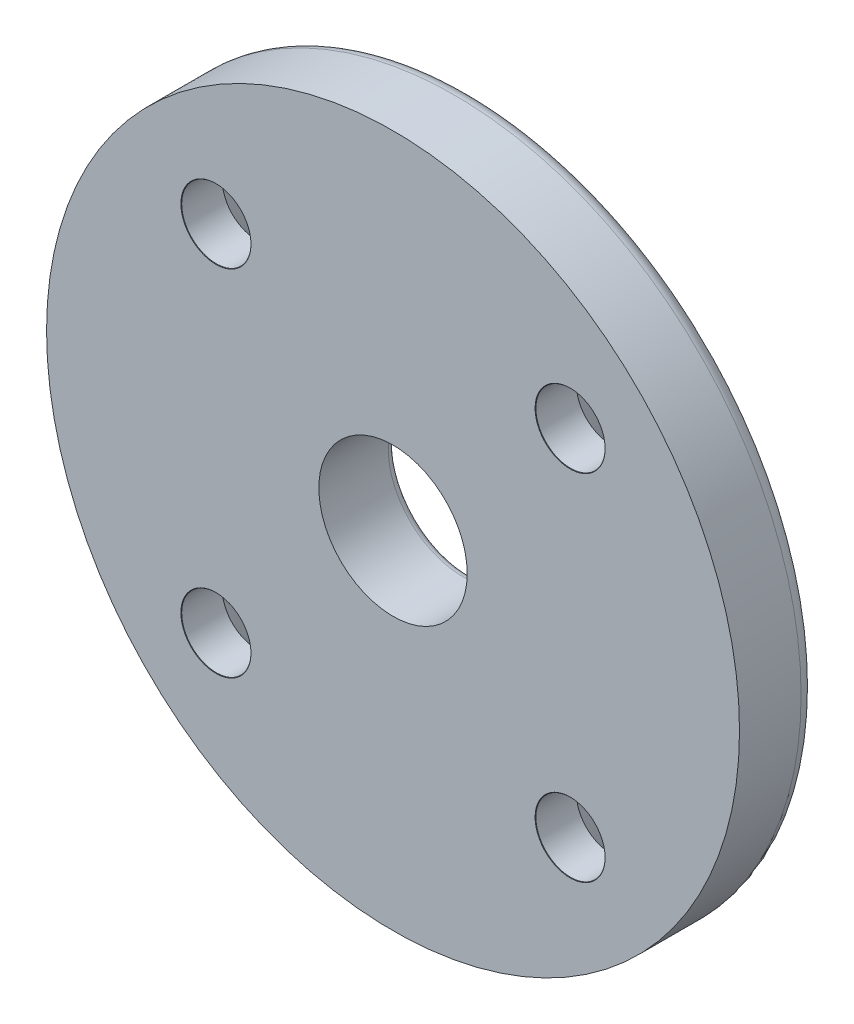
ISO-10303-21;
HEADER;
FILE_DESCRIPTION(('STEP AP214'),'2;1');
FILE_NAME('part.step','',(''),(''),'','','');
FILE_SCHEMA(('AUTOMOTIVE_DESIGN { 1 0 10303 214 1 1 1 1 }'));
ENDSEC;
DATA;
#1=APPLICATION_CONTEXT('core data for automotive mechanical design processes');
#2=APPLICATION_PROTOCOL_DEFINITION('international standard','automotive_design',2000,#1);
#3=PRODUCT_CONTEXT('',#1,'mechanical');
#4=PRODUCT('Part','Part','',(#3));
#5=PRODUCT_RELATED_PRODUCT_CATEGORY('part','',(#4));
#6=PRODUCT_DEFINITION_FORMATION('','',#4);
#7=PRODUCT_DEFINITION_CONTEXT('part definition',#1,'design');
#8=PRODUCT_DEFINITION('design','',#6,#7);
#9=PRODUCT_DEFINITION_SHAPE('','',#8);
#10=(LENGTH_UNIT() NAMED_UNIT(*) SI_UNIT(.MILLI.,.METRE.));
#11=(NAMED_UNIT(*) PLANE_ANGLE_UNIT() SI_UNIT($,.RADIAN.));
#12=(NAMED_UNIT(*) SI_UNIT($,.STERADIAN.) SOLID_ANGLE_UNIT());
#13=UNCERTAINTY_MEASURE_WITH_UNIT(LENGTH_MEASURE(1.E-05),#10,'distance_accuracy_value','');
#14=(GEOMETRIC_REPRESENTATION_CONTEXT(3) GLOBAL_UNCERTAINTY_ASSIGNED_CONTEXT((#13)) GLOBAL_UNIT_ASSIGNED_CONTEXT((#10,
#11,#12)) REPRESENTATION_CONTEXT('',''));
#15=CARTESIAN_POINT('',(0.,0.,0.));
#16=DIRECTION('',(0.,0.,1.));
#17=DIRECTION('',(1.,0.,0.));
#18=AXIS2_PLACEMENT_3D('',#15,#16,#17);
#19=CARTESIAN_POINT('',(0.,0.,0.));
#20=DIRECTION('',(0.,0.,1.));
#21=DIRECTION('',(1.,0.,0.));
#22=AXIS2_PLACEMENT_3D('',#19,#20,#21);
#23=PLANE('',#22);
#24=CARTESIAN_POINT('',(11.5,11.5,0.));
#25=DIRECTION('',(0.,0.,-1.));
#26=DIRECTION('',(-1.,0.,0.));
#27=AXIS2_PLACEMENT_3D('',#24,#25,#26);
#28=CIRCLE('',#27,4.59);
#29=CARTESIAN_POINT('',(6.91,11.5,0.));
#30=VERTEX_POINT('',#29);
#31=EDGE_CURVE('E102',#30,#30,#28,.T.);
#32=ORIENTED_EDGE('',*,*,#31,.F.);
#33=EDGE_LOOP('',(#32));
#34=FACE_BOUND('',#33,.T.);
#35=CARTESIAN_POINT('',(-11.5,11.5,0.));
#36=DIRECTION('',(0.,0.,-1.));
#37=DIRECTION('',(-1.,0.,0.));
#38=AXIS2_PLACEMENT_3D('',#35,#36,#37);
#39=CIRCLE('',#38,4.59);
#40=CARTESIAN_POINT('',(-16.09,11.5,0.));
#41=VERTEX_POINT('',#40);
#42=EDGE_CURVE('E90',#41,#41,#39,.T.);
#43=ORIENTED_EDGE('',*,*,#42,.F.);
#44=EDGE_LOOP('',(#43));
#45=FACE_BOUND('',#44,.T.);
#46=CARTESIAN_POINT('',(0.,0.,0.));
#47=DIRECTION('',(0.,0.,1.));
#48=DIRECTION('',(1.,0.,0.));
#49=AXIS2_PLACEMENT_3D('',#46,#47,#48);
#50=CIRCLE('',#49,21.5);
#51=CARTESIAN_POINT('',(21.5,0.,0.));
#52=VERTEX_POINT('',#51);
#53=EDGE_CURVE('E45',#52,#52,#50,.F.);
#54=ORIENTED_EDGE('',*,*,#53,.T.);
#55=EDGE_LOOP('',(#54));
#56=FACE_BOUND('',#55,.T.);
#57=CARTESIAN_POINT('',(0.,0.,0.));
#58=DIRECTION('',(0.,0.,1.));
#59=DIRECTION('',(1.,0.,0.));
#60=AXIS2_PLACEMENT_3D('',#57,#58,#59);
#61=CIRCLE('',#60,5.31847519493753);
#62=CARTESIAN_POINT('',(5.31847519493753,0.,0.));
#63=VERTEX_POINT('',#62);
#64=EDGE_CURVE('E41',#63,#63,#61,.T.);
#65=ORIENTED_EDGE('',*,*,#64,.T.);
#66=EDGE_LOOP('',(#65));
#67=FACE_BOUND('',#66,.T.);
#68=CARTESIAN_POINT('',(-11.5,-11.5,0.));
#69=DIRECTION('',(0.,0.,-1.));
#70=DIRECTION('',(-1.,0.,0.));
#71=AXIS2_PLACEMENT_3D('',#68,#69,#70);
#72=CIRCLE('',#71,4.59);
#73=CARTESIAN_POINT('',(-16.09,-11.5,0.));
#74=VERTEX_POINT('',#73);
#75=EDGE_CURVE('E66',#74,#74,#72,.T.);
#76=ORIENTED_EDGE('',*,*,#75,.F.);
#77=EDGE_LOOP('',(#76));
#78=FACE_BOUND('',#77,.T.);
#79=CARTESIAN_POINT('',(11.5,-11.5,0.));
#80=DIRECTION('',(0.,0.,-1.));
#81=DIRECTION('',(-1.,0.,0.));
#82=AXIS2_PLACEMENT_3D('',#79,#80,#81);
#83=CIRCLE('',#82,4.59);
#84=CARTESIAN_POINT('',(6.91,-11.5,0.));
#85=VERTEX_POINT('',#84);
#86=EDGE_CURVE('E78',#85,#85,#83,.T.);
#87=ORIENTED_EDGE('',*,*,#86,.F.);
#88=EDGE_LOOP('',(#87));
#89=FACE_BOUND('',#88,.T.);
#90=ADVANCED_FACE('F34',(#34,#45,#56,#67,#78,#89),#23,.F.);
#91=CARTESIAN_POINT('',(0.,0.,5.));
#92=DIRECTION('',(0.,0.,1.));
#93=DIRECTION('',(1.,0.,0.));
#94=AXIS2_PLACEMENT_3D('',#91,#92,#93);
#95=PLANE('',#94);
#96=CARTESIAN_POINT('',(11.5,11.5,5.));
#97=DIRECTION('',(0.,0.,-1.));
#98=DIRECTION('',(-1.,0.,0.));
#99=AXIS2_PLACEMENT_3D('',#96,#97,#98);
#100=CIRCLE('',#99,2.275);
#101=CARTESIAN_POINT('',(9.225,11.5,5.));
#102=VERTEX_POINT('',#101);
#103=EDGE_CURVE('E105',#102,#102,#100,.T.);
#104=ORIENTED_EDGE('',*,*,#103,.T.);
#105=EDGE_LOOP('',(#104));
#106=FACE_BOUND('',#105,.T.);
#107=CARTESIAN_POINT('',(-11.5,11.5,5.));
#108=DIRECTION('',(0.,0.,-1.));
#109=DIRECTION('',(-1.,0.,0.));
#110=AXIS2_PLACEMENT_3D('',#107,#108,#109);
#111=CIRCLE('',#110,2.275);
#112=CARTESIAN_POINT('',(-13.775,11.5,5.));
#113=VERTEX_POINT('',#112);
#114=EDGE_CURVE('E93',#113,#113,#111,.T.);
#115=ORIENTED_EDGE('',*,*,#114,.T.);
#116=EDGE_LOOP('',(#115));
#117=FACE_BOUND('',#116,.T.);
#118=CARTESIAN_POINT('',(11.5,-11.5,5.));
#119=DIRECTION('',(0.,0.,-1.));
#120=DIRECTION('',(-1.,0.,0.));
#121=AXIS2_PLACEMENT_3D('',#118,#119,#120);
#122=CIRCLE('',#121,2.275);
#123=CARTESIAN_POINT('',(9.225,-11.5,5.));
#124=VERTEX_POINT('',#123);
#125=EDGE_CURVE('E81',#124,#124,#122,.T.);
#126=ORIENTED_EDGE('',*,*,#125,.T.);
#127=EDGE_LOOP('',(#126));
#128=FACE_BOUND('',#127,.T.);
#129=CARTESIAN_POINT('',(-11.5,-11.5,5.));
#130=DIRECTION('',(0.,0.,-1.));
#131=DIRECTION('',(-1.,0.,0.));
#132=AXIS2_PLACEMENT_3D('',#129,#130,#131);
#133=CIRCLE('',#132,2.275);
#134=CARTESIAN_POINT('',(-13.775,-11.5,5.));
#135=VERTEX_POINT('',#134);
#136=EDGE_CURVE('E69',#135,#135,#133,.T.);
#137=ORIENTED_EDGE('',*,*,#136,.T.);
#138=EDGE_LOOP('',(#137));
#139=FACE_BOUND('',#138,.T.);
#140=CARTESIAN_POINT('',(0.,0.,5.));
#141=DIRECTION('',(0.,0.,1.));
#142=DIRECTION('',(1.,0.,0.));
#143=AXIS2_PLACEMENT_3D('',#140,#141,#142);
#144=CIRCLE('',#143,22.5);
#145=CARTESIAN_POINT('',(22.5,0.,5.));
#146=VERTEX_POINT('',#145);
#147=EDGE_CURVE('E53',#146,#146,#144,.T.);
#148=ORIENTED_EDGE('',*,*,#147,.T.);
#149=EDGE_LOOP('',(#148));
#150=FACE_BOUND('',#149,.T.);
#151=CARTESIAN_POINT('',(0.,0.,5.));
#152=DIRECTION('',(0.,0.,1.));
#153=DIRECTION('',(1.,0.,0.));
#154=AXIS2_PLACEMENT_3D('',#151,#152,#153);
#155=CIRCLE('',#154,4.81847519493753);
#156=CARTESIAN_POINT('',(4.81847519493753,0.,5.));
#157=VERTEX_POINT('',#156);
#158=EDGE_CURVE('E57',#157,#157,#155,.T.);
#159=ORIENTED_EDGE('',*,*,#158,.F.);
#160=EDGE_LOOP('',(#159));
#161=FACE_BOUND('',#160,.T.);
#162=ADVANCED_FACE('F109',(#106,#117,#128,#139,#150,#161),#95,.T.);
#163=CARTESIAN_POINT('',(0.,0.,5.));
#164=DIRECTION('',(0.,0.,-1.));
#165=DIRECTION('',(-1.,0.,0.));
#166=AXIS2_PLACEMENT_3D('',#163,#164,#165);
#167=CYLINDRICAL_SURFACE('',#166,22.5);
#168=CARTESIAN_POINT('',(0.,0.,1.));
#169=DIRECTION('',(0.,0.,1.));
#170=DIRECTION('',(1.,0.,0.));
#171=AXIS2_PLACEMENT_3D('',#168,#169,#170);
#172=CIRCLE('',#171,22.5);
#173=CARTESIAN_POINT('',(22.5,0.,1.));
#174=VERTEX_POINT('',#173);
#175=EDGE_CURVE('E49',#174,#174,#172,.T.);
#176=ORIENTED_EDGE('',*,*,#175,.T.);
#177=EDGE_LOOP('',(#176));
#178=FACE_BOUND('',#177,.T.);
#179=ORIENTED_EDGE('',*,*,#147,.F.);
#180=EDGE_LOOP('',(#179));
#181=FACE_BOUND('',#180,.T.);
#182=ADVANCED_FACE('F180',(#178,#181),#167,.T.);
#183=CARTESIAN_POINT('',(0.,0.,5.));
#184=DIRECTION('',(0.,0.,-1.));
#185=DIRECTION('',(-1.,0.,0.));
#186=AXIS2_PLACEMENT_3D('',#183,#184,#185);
#187=CYLINDRICAL_SURFACE('',#186,4.81847519493753);
#188=CARTESIAN_POINT('',(0.,0.,0.5));
#189=DIRECTION('',(0.,0.,1.));
#190=DIRECTION('',(1.,0.,0.));
#191=AXIS2_PLACEMENT_3D('',#188,#189,#190);
#192=CIRCLE('',#191,4.81847519493753);
#193=CARTESIAN_POINT('',(4.81847519493753,0.,0.5));
#194=VERTEX_POINT('',#193);
#195=EDGE_CURVE('E11',#194,#194,#192,.F.);
#196=ORIENTED_EDGE('',*,*,#195,.T.);
#197=EDGE_LOOP('',(#196));
#198=FACE_BOUND('',#197,.T.);
#199=ORIENTED_EDGE('',*,*,#158,.T.);
#200=EDGE_LOOP('',(#199));
#201=FACE_BOUND('',#200,.T.);
#202=ADVANCED_FACE('F176',(#198,#201),#187,.F.);
#203=CARTESIAN_POINT('',(0.,0.,1.));
#204=DIRECTION('',(0.,0.,1.));
#205=DIRECTION('',(1.,0.,0.));
#206=AXIS2_PLACEMENT_3D('',#203,#204,#205);
#207=TOROIDAL_SURFACE('',#206,21.5,1.);
#208=ORIENTED_EDGE('',*,*,#53,.F.);
#209=EDGE_LOOP('',(#208));
#210=FACE_BOUND('',#209,.T.);
#211=ORIENTED_EDGE('',*,*,#175,.F.);
#212=EDGE_LOOP('',(#211));
#213=FACE_BOUND('',#212,.T.);
#214=ADVANCED_FACE('F179',(#210,#213),#207,.T.);
#215=CARTESIAN_POINT('',(0.,0.,0.5));
#216=DIRECTION('',(0.,0.,1.));
#217=DIRECTION('',(1.,0.,0.));
#218=AXIS2_PLACEMENT_3D('',#215,#216,#217);
#219=TOROIDAL_SURFACE('',#218,5.31847519493753,0.5);
#220=ORIENTED_EDGE('',*,*,#195,.F.);
#221=EDGE_LOOP('',(#220));
#222=FACE_BOUND('',#221,.T.);
#223=ORIENTED_EDGE('',*,*,#64,.F.);
#224=EDGE_LOOP('',(#223));
#225=FACE_BOUND('',#224,.T.);
#226=ADVANCED_FACE('F36',(#222,#225),#219,.T.);
#227=CARTESIAN_POINT('',(-11.5,-11.5,4.975));
#228=DIRECTION('',(0.,0.,1.));
#229=DIRECTION('',(1.,0.,0.));
#230=AXIS2_PLACEMENT_3D('',#227,#228,#229);
#231=CONICAL_SURFACE('',#230,2.25,0.785398163397466);
#232=ORIENTED_EDGE('',*,*,#136,.F.);
#233=EDGE_LOOP('',(#232));
#234=FACE_BOUND('',#233,.T.);
#235=CARTESIAN_POINT('',(-11.5,-11.5,4.975));
#236=DIRECTION('',(0.,0.,-1.));
#237=DIRECTION('',(-1.,0.,0.));
#238=AXIS2_PLACEMENT_3D('',#235,#236,#237);
#239=CIRCLE('',#238,2.25);
#240=CARTESIAN_POINT('',(-13.75,-11.5,4.975));
#241=VERTEX_POINT('',#240);
#242=EDGE_CURVE('E60',#241,#241,#239,.T.);
#243=ORIENTED_EDGE('',*,*,#242,.T.);
#244=EDGE_LOOP('',(#243));
#245=FACE_BOUND('',#244,.T.);
#246=ADVANCED_FACE('F171',(#234,#245),#231,.F.);
#247=CARTESIAN_POINT('',(-11.5,-11.5,0.));
#248=DIRECTION('',(0.,0.,-1.));
#249=DIRECTION('',(-1.,0.,0.));
#250=AXIS2_PLACEMENT_3D('',#247,#248,#249);
#251=CYLINDRICAL_SURFACE('',#250,2.25);
#252=ORIENTED_EDGE('',*,*,#242,.F.);
#253=EDGE_LOOP('',(#252));
#254=FACE_BOUND('',#253,.T.);
#255=CARTESIAN_POINT('',(-11.5,-11.5,2.34));
#256=DIRECTION('',(0.,0.,-1.));
#257=DIRECTION('',(-1.,0.,0.));
#258=AXIS2_PLACEMENT_3D('',#255,#256,#257);
#259=CIRCLE('',#258,2.25);
#260=CARTESIAN_POINT('',(-13.75,-11.5,2.34));
#261=VERTEX_POINT('',#260);
#262=EDGE_CURVE('E63',#261,#261,#259,.T.);
#263=ORIENTED_EDGE('',*,*,#262,.T.);
#264=EDGE_LOOP('',(#263));
#265=FACE_BOUND('',#264,.T.);
#266=ADVANCED_FACE('F167',(#254,#265),#251,.F.);
#267=CARTESIAN_POINT('',(-11.5,-11.5,0.));
#268=DIRECTION('',(0.,0.,-1.));
#269=DIRECTION('',(-1.,0.,0.));
#270=AXIS2_PLACEMENT_3D('',#267,#268,#269);
#271=CONICAL_SURFACE('',#270,4.59,0.785398163397448);
#272=ORIENTED_EDGE('',*,*,#262,.F.);
#273=EDGE_LOOP('',(#272));
#274=FACE_BOUND('',#273,.T.);
#275=ORIENTED_EDGE('',*,*,#75,.T.);
#276=EDGE_LOOP('',(#275));
#277=FACE_BOUND('',#276,.T.);
#278=ADVANCED_FACE('F163',(#274,#277),#271,.F.);
#279=CARTESIAN_POINT('',(11.5,-11.5,4.975));
#280=DIRECTION('',(0.,0.,1.));
#281=DIRECTION('',(1.,0.,0.));
#282=AXIS2_PLACEMENT_3D('',#279,#280,#281);
#283=CONICAL_SURFACE('',#282,2.25,0.785398163397466);
#284=ORIENTED_EDGE('',*,*,#125,.F.);
#285=EDGE_LOOP('',(#284));
#286=FACE_BOUND('',#285,.T.);
#287=CARTESIAN_POINT('',(11.5,-11.5,4.975));
#288=DIRECTION('',(0.,0.,-1.));
#289=DIRECTION('',(-1.,0.,0.));
#290=AXIS2_PLACEMENT_3D('',#287,#288,#289);
#291=CIRCLE('',#290,2.25);
#292=CARTESIAN_POINT('',(9.25,-11.5,4.975));
#293=VERTEX_POINT('',#292);
#294=EDGE_CURVE('E72',#293,#293,#291,.T.);
#295=ORIENTED_EDGE('',*,*,#294,.T.);
#296=EDGE_LOOP('',(#295));
#297=FACE_BOUND('',#296,.T.);
#298=ADVANCED_FACE('F155',(#286,#297),#283,.F.);
#299=CARTESIAN_POINT('',(11.5,-11.5,0.));
#300=DIRECTION('',(0.,0.,-1.));
#301=DIRECTION('',(-1.,0.,0.));
#302=AXIS2_PLACEMENT_3D('',#299,#300,#301);
#303=CYLINDRICAL_SURFACE('',#302,2.25);
#304=ORIENTED_EDGE('',*,*,#294,.F.);
#305=EDGE_LOOP('',(#304));
#306=FACE_BOUND('',#305,.T.);
#307=CARTESIAN_POINT('',(11.5,-11.5,2.34));
#308=DIRECTION('',(0.,0.,-1.));
#309=DIRECTION('',(-1.,0.,0.));
#310=AXIS2_PLACEMENT_3D('',#307,#308,#309);
#311=CIRCLE('',#310,2.25);
#312=CARTESIAN_POINT('',(9.25,-11.5,2.34));
#313=VERTEX_POINT('',#312);
#314=EDGE_CURVE('E75',#313,#313,#311,.T.);
#315=ORIENTED_EDGE('',*,*,#314,.T.);
#316=EDGE_LOOP('',(#315));
#317=FACE_BOUND('',#316,.T.);
#318=ADVANCED_FACE('F145',(#306,#317),#303,.F.);
#319=CARTESIAN_POINT('',(11.5,-11.5,0.));
#320=DIRECTION('',(0.,0.,-1.));
#321=DIRECTION('',(-1.,0.,0.));
#322=AXIS2_PLACEMENT_3D('',#319,#320,#321);
#323=CONICAL_SURFACE('',#322,4.59,0.785398163397448);
#324=ORIENTED_EDGE('',*,*,#314,.F.);
#325=EDGE_LOOP('',(#324));
#326=FACE_BOUND('',#325,.T.);
#327=ORIENTED_EDGE('',*,*,#86,.T.);
#328=EDGE_LOOP('',(#327));
#329=FACE_BOUND('',#328,.T.);
#330=ADVANCED_FACE('F142',(#326,#329),#323,.F.);
#331=CARTESIAN_POINT('',(-11.5,11.5,4.975));
#332=DIRECTION('',(0.,0.,1.));
#333=DIRECTION('',(1.,0.,0.));
#334=AXIS2_PLACEMENT_3D('',#331,#332,#333);
#335=CONICAL_SURFACE('',#334,2.25,0.785398163397466);
#336=ORIENTED_EDGE('',*,*,#114,.F.);
#337=EDGE_LOOP('',(#336));
#338=FACE_BOUND('',#337,.T.);
#339=CARTESIAN_POINT('',(-11.5,11.5,4.975));
#340=DIRECTION('',(0.,0.,-1.));
#341=DIRECTION('',(-1.,0.,0.));
#342=AXIS2_PLACEMENT_3D('',#339,#340,#341);
#343=CIRCLE('',#342,2.25);
#344=CARTESIAN_POINT('',(-13.75,11.5,4.975));
#345=VERTEX_POINT('',#344);
#346=EDGE_CURVE('E84',#345,#345,#343,.T.);
#347=ORIENTED_EDGE('',*,*,#346,.T.);
#348=EDGE_LOOP('',(#347));
#349=FACE_BOUND('',#348,.T.);
#350=ADVANCED_FACE('F144',(#338,#349),#335,.F.);
#351=CARTESIAN_POINT('',(-11.5,11.5,0.));
#352=DIRECTION('',(0.,0.,-1.));
#353=DIRECTION('',(-1.,0.,0.));
#354=AXIS2_PLACEMENT_3D('',#351,#352,#353);
#355=CYLINDRICAL_SURFACE('',#354,2.25);
#356=ORIENTED_EDGE('',*,*,#346,.F.);
#357=EDGE_LOOP('',(#356));
#358=FACE_BOUND('',#357,.T.);
#359=CARTESIAN_POINT('',(-11.5,11.5,2.34));
#360=DIRECTION('',(0.,0.,-1.));
#361=DIRECTION('',(-1.,0.,0.));
#362=AXIS2_PLACEMENT_3D('',#359,#360,#361);
#363=CIRCLE('',#362,2.25);
#364=CARTESIAN_POINT('',(-13.75,11.5,2.34));
#365=VERTEX_POINT('',#364);
#366=EDGE_CURVE('E87',#365,#365,#363,.T.);
#367=ORIENTED_EDGE('',*,*,#366,.T.);
#368=EDGE_LOOP('',(#367));
#369=FACE_BOUND('',#368,.T.);
#370=ADVANCED_FACE('F152',(#358,#369),#355,.F.);
#371=CARTESIAN_POINT('',(-11.5,11.5,0.));
#372=DIRECTION('',(0.,0.,-1.));
#373=DIRECTION('',(-1.,0.,0.));
#374=AXIS2_PLACEMENT_3D('',#371,#372,#373);
#375=CONICAL_SURFACE('',#374,4.59,0.785398163397448);
#376=ORIENTED_EDGE('',*,*,#366,.F.);
#377=EDGE_LOOP('',(#376));
#378=FACE_BOUND('',#377,.T.);
#379=ORIENTED_EDGE('',*,*,#42,.T.);
#380=EDGE_LOOP('',(#379));
#381=FACE_BOUND('',#380,.T.);
#382=ADVANCED_FACE('F116',(#378,#381),#375,.F.);
#383=CARTESIAN_POINT('',(11.5,11.5,4.975));
#384=DIRECTION('',(0.,0.,1.));
#385=DIRECTION('',(1.,0.,0.));
#386=AXIS2_PLACEMENT_3D('',#383,#384,#385);
#387=CONICAL_SURFACE('',#386,2.25,0.785398163397466);
#388=ORIENTED_EDGE('',*,*,#103,.F.);
#389=EDGE_LOOP('',(#388));
#390=FACE_BOUND('',#389,.T.);
#391=CARTESIAN_POINT('',(11.5,11.5,4.975));
#392=DIRECTION('',(0.,0.,-1.));
#393=DIRECTION('',(-1.,0.,0.));
#394=AXIS2_PLACEMENT_3D('',#391,#392,#393);
#395=CIRCLE('',#394,2.25);
#396=CARTESIAN_POINT('',(9.25,11.5,4.975));
#397=VERTEX_POINT('',#396);
#398=EDGE_CURVE('E96',#397,#397,#395,.T.);
#399=ORIENTED_EDGE('',*,*,#398,.T.);
#400=EDGE_LOOP('',(#399));
#401=FACE_BOUND('',#400,.T.);
#402=ADVANCED_FACE('F112',(#390,#401),#387,.F.);
#403=CARTESIAN_POINT('',(11.5,11.5,0.));
#404=DIRECTION('',(0.,0.,-1.));
#405=DIRECTION('',(-1.,0.,0.));
#406=AXIS2_PLACEMENT_3D('',#403,#404,#405);
#407=CYLINDRICAL_SURFACE('',#406,2.25);
#408=ORIENTED_EDGE('',*,*,#398,.F.);
#409=EDGE_LOOP('',(#408));
#410=FACE_BOUND('',#409,.T.);
#411=CARTESIAN_POINT('',(11.5,11.5,2.34));
#412=DIRECTION('',(0.,0.,-1.));
#413=DIRECTION('',(-1.,0.,0.));
#414=AXIS2_PLACEMENT_3D('',#411,#412,#413);
#415=CIRCLE('',#414,2.25);
#416=CARTESIAN_POINT('',(9.25,11.5,2.34));
#417=VERTEX_POINT('',#416);
#418=EDGE_CURVE('E99',#417,#417,#415,.T.);
#419=ORIENTED_EDGE('',*,*,#418,.T.);
#420=EDGE_LOOP('',(#419));
#421=FACE_BOUND('',#420,.T.);
#422=ADVANCED_FACE('F115',(#410,#421),#407,.F.);
#423=CARTESIAN_POINT('',(11.5,11.5,0.));
#424=DIRECTION('',(0.,0.,-1.));
#425=DIRECTION('',(-1.,0.,0.));
#426=AXIS2_PLACEMENT_3D('',#423,#424,#425);
#427=CONICAL_SURFACE('',#426,4.59,0.785398163397448);
#428=ORIENTED_EDGE('',*,*,#418,.F.);
#429=EDGE_LOOP('',(#428));
#430=FACE_BOUND('',#429,.T.);
#431=ORIENTED_EDGE('',*,*,#31,.T.);
#432=EDGE_LOOP('',(#431));
#433=FACE_BOUND('',#432,.T.);
#434=ADVANCED_FACE('F122',(#430,#433),#427,.F.);
#435=CLOSED_SHELL('',(#90,#162,#182,#202,#214,#226,#246,#266,#278,#298,#318,#330,#350,#370,#382,
#402,#422,#434));
#436=MANIFOLD_SOLID_BREP('B2',#435);
#437=ADVANCED_BREP_SHAPE_REPRESENTATION('',(#18,#436),#14);
#438=SHAPE_DEFINITION_REPRESENTATION(#9,#437);
ENDSEC;
END-ISO-10303-21;
